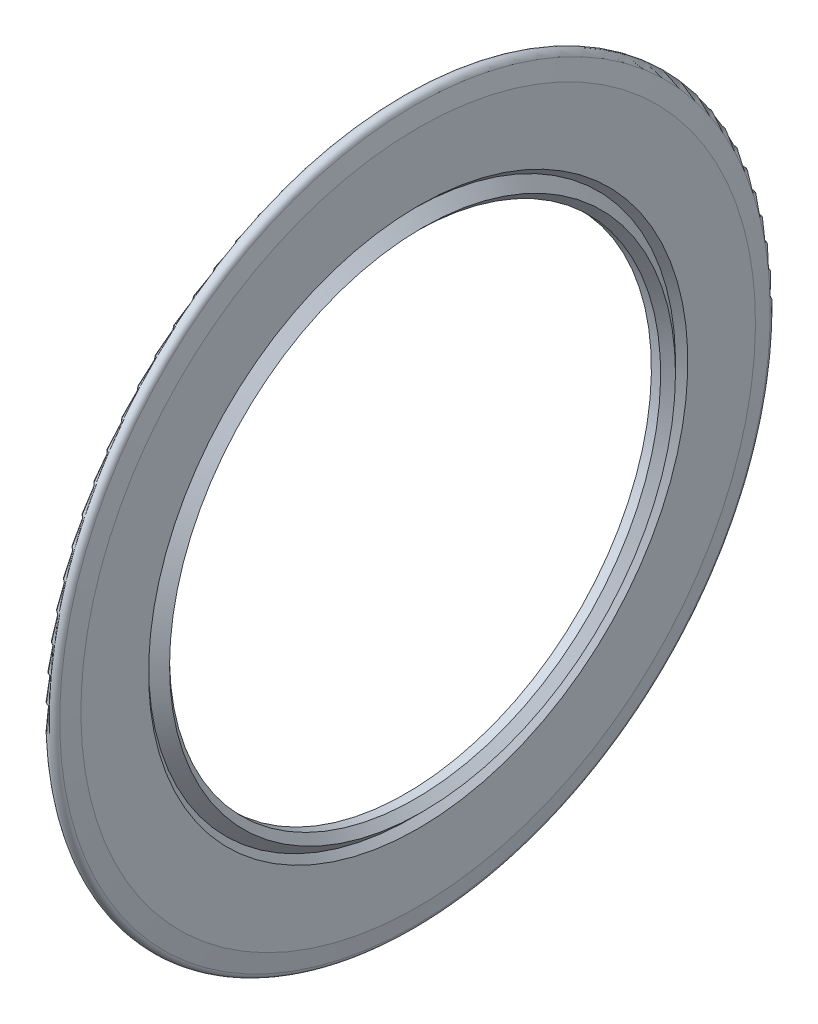
ISO-10303-21;
HEADER;
FILE_DESCRIPTION(('STEP AP214'),'2;1');
FILE_NAME('part.step','',(''),(''),'','','');
FILE_SCHEMA(('AUTOMOTIVE_DESIGN { 1 0 10303 214 1 1 1 1 }'));
ENDSEC;
DATA;
#1=APPLICATION_CONTEXT('core data for automotive mechanical design processes');
#2=APPLICATION_PROTOCOL_DEFINITION('international standard','automotive_design',2000,#1);
#3=PRODUCT_CONTEXT('',#1,'mechanical');
#4=PRODUCT('Part','Part','',(#3));
#5=PRODUCT_RELATED_PRODUCT_CATEGORY('part','',(#4));
#6=PRODUCT_DEFINITION_FORMATION('','',#4);
#7=PRODUCT_DEFINITION_CONTEXT('part definition',#1,'design');
#8=PRODUCT_DEFINITION('design','',#6,#7);
#9=PRODUCT_DEFINITION_SHAPE('','',#8);
#10=(LENGTH_UNIT() NAMED_UNIT(*) SI_UNIT(.MILLI.,.METRE.));
#11=(NAMED_UNIT(*) PLANE_ANGLE_UNIT() SI_UNIT($,.RADIAN.));
#12=(NAMED_UNIT(*) SI_UNIT($,.STERADIAN.) SOLID_ANGLE_UNIT());
#13=UNCERTAINTY_MEASURE_WITH_UNIT(LENGTH_MEASURE(1.E-05),#10,'distance_accuracy_value','');
#14=(GEOMETRIC_REPRESENTATION_CONTEXT(3) GLOBAL_UNCERTAINTY_ASSIGNED_CONTEXT((#13)) GLOBAL_UNIT_ASSIGNED_CONTEXT((#10,
#11,#12)) REPRESENTATION_CONTEXT('',''));
#15=CARTESIAN_POINT('',(0.,0.,0.));
#16=DIRECTION('',(0.,0.,1.));
#17=DIRECTION('',(1.,0.,0.));
#18=AXIS2_PLACEMENT_3D('',#15,#16,#17);
#19=CARTESIAN_POINT('',(0.23,25.73235,0.));
#20=DIRECTION('',(-1.,0.,0.));
#21=DIRECTION('',(0.,-1.,0.));
#22=AXIS2_PLACEMENT_3D('',#19,#20,#21);
#23=PLANE('',#22);
#24=CARTESIAN_POINT('',(0.23,0.,0.));
#25=DIRECTION('',(1.,0.,0.));
#26=DIRECTION('',(0.,1.,0.));
#27=AXIS2_PLACEMENT_3D('',#24,#25,#26);
#28=CIRCLE('',#27,25.08835);
#29=CARTESIAN_POINT('',(0.23,25.08835,0.));
#30=VERTEX_POINT('',#29);
#31=EDGE_CURVE('E11',#30,#30,#28,.T.);
#32=ORIENTED_EDGE('',*,*,#31,.T.);
#33=EDGE_LOOP('',(#32));
#34=FACE_BOUND('',#33,.T.);
#35=CARTESIAN_POINT('',(0.23,0.,0.));
#36=DIRECTION('',(1.,0.,0.));
#37=DIRECTION('',(0.,1.,0.));
#38=AXIS2_PLACEMENT_3D('',#35,#36,#37);
#39=CIRCLE('',#38,26.37635);
#40=CARTESIAN_POINT('',(0.23,26.37635,0.));
#41=VERTEX_POINT('',#40);
#42=EDGE_CURVE('E107',#41,#41,#39,.T.);
#43=ORIENTED_EDGE('',*,*,#42,.F.);
#44=EDGE_LOOP('',(#43));
#45=FACE_BOUND('',#44,.T.);
#46=ADVANCED_FACE('F17',(#34,#45),#23,.T.);
#47=CARTESIAN_POINT('',(0.345,0.,0.));
#48=DIRECTION('',(-1.,0.,0.));
#49=DIRECTION('',(0.,1.,0.));
#50=AXIS2_PLACEMENT_3D('',#47,#48,#49);
#51=CONICAL_SURFACE('',#50,24.97335,0.785398163397448);
#52=CARTESIAN_POINT('',(0.46,0.,0.));
#53=DIRECTION('',(1.,0.,0.));
#54=DIRECTION('',(0.,1.,0.));
#55=AXIS2_PLACEMENT_3D('',#52,#53,#54);
#56=CIRCLE('',#55,24.85835);
#57=CARTESIAN_POINT('',(0.46,24.85835,0.));
#58=VERTEX_POINT('',#57);
#59=EDGE_CURVE('E28',#58,#58,#56,.T.);
#60=ORIENTED_EDGE('',*,*,#59,.T.);
#61=EDGE_LOOP('',(#60));
#62=FACE_BOUND('',#61,.T.);
#63=ORIENTED_EDGE('',*,*,#31,.F.);
#64=EDGE_LOOP('',(#63));
#65=FACE_BOUND('',#64,.T.);
#66=ADVANCED_FACE('F155',(#62,#65),#51,.F.);
#67=CARTESIAN_POINT('',(0.46,22.67335,0.));
#68=DIRECTION('',(-1.,0.,0.));
#69=DIRECTION('',(0.,-1.,0.));
#70=AXIS2_PLACEMENT_3D('',#67,#68,#69);
#71=PLANE('',#70);
#72=CARTESIAN_POINT('',(0.46,0.,0.));
#73=DIRECTION('',(1.,0.,0.));
#74=DIRECTION('',(0.,1.,0.));
#75=AXIS2_PLACEMENT_3D('',#72,#73,#74);
#76=CIRCLE('',#75,20.48835);
#77=CARTESIAN_POINT('',(0.46,20.48835,0.));
#78=VERTEX_POINT('',#77);
#79=EDGE_CURVE('E67',#78,#78,#76,.T.);
#80=ORIENTED_EDGE('',*,*,#79,.T.);
#81=EDGE_LOOP('',(#80));
#82=FACE_BOUND('',#81,.T.);
#83=ORIENTED_EDGE('',*,*,#59,.F.);
#84=EDGE_LOOP('',(#83));
#85=FACE_BOUND('',#84,.T.);
#86=ADVANCED_FACE('F161',(#82,#85),#71,.T.);
#87=CARTESIAN_POINT('',(0.345,0.,0.));
#88=DIRECTION('',(1.,0.,0.));
#89=DIRECTION('',(0.,1.,0.));
#90=AXIS2_PLACEMENT_3D('',#87,#88,#89);
#91=CONICAL_SURFACE('',#90,20.37335,0.785398163397448);
#92=CARTESIAN_POINT('',(0.23,0.,0.));
#93=DIRECTION('',(1.,0.,0.));
#94=DIRECTION('',(0.,1.,0.));
#95=AXIS2_PLACEMENT_3D('',#92,#93,#94);
#96=CIRCLE('',#95,20.25835);
#97=CARTESIAN_POINT('',(0.23,20.25835,0.));
#98=VERTEX_POINT('',#97);
#99=EDGE_CURVE('E74',#98,#98,#96,.T.);
#100=ORIENTED_EDGE('',*,*,#99,.T.);
#101=EDGE_LOOP('',(#100));
#102=FACE_BOUND('',#101,.T.);
#103=ORIENTED_EDGE('',*,*,#79,.F.);
#104=EDGE_LOOP('',(#103));
#105=FACE_BOUND('',#104,.T.);
#106=ADVANCED_FACE('F194',(#102,#105),#91,.T.);
#107=CARTESIAN_POINT('',(0.23,19.93635,0.));
#108=DIRECTION('',(-1.,0.,0.));
#109=DIRECTION('',(0.,-1.,0.));
#110=AXIS2_PLACEMENT_3D('',#107,#108,#109);
#111=PLANE('',#110);
#112=CARTESIAN_POINT('',(0.23,0.,0.));
#113=DIRECTION('',(1.,0.,0.));
#114=DIRECTION('',(0.,1.,0.));
#115=AXIS2_PLACEMENT_3D('',#112,#113,#114);
#116=CIRCLE('',#115,19.61435);
#117=CARTESIAN_POINT('',(0.23,19.61435,0.));
#118=VERTEX_POINT('',#117);
#119=EDGE_CURVE('E78',#118,#118,#116,.T.);
#120=ORIENTED_EDGE('',*,*,#119,.T.);
#121=EDGE_LOOP('',(#120));
#122=FACE_BOUND('',#121,.T.);
#123=ORIENTED_EDGE('',*,*,#99,.F.);
#124=EDGE_LOOP('',(#123));
#125=FACE_BOUND('',#124,.T.);
#126=ADVANCED_FACE('F196',(#122,#125),#111,.T.);
#127=CARTESIAN_POINT('',(0.6206625,0.,0.));
#128=DIRECTION('',(-1.,0.,0.));
#129=DIRECTION('',(0.,1.,0.));
#130=AXIS2_PLACEMENT_3D('',#127,#128,#129);
#131=CONICAL_SURFACE('',#130,19.2236875,0.78539816339745);
#132=CARTESIAN_POINT('',(1.011325,0.,0.));
#133=DIRECTION('',(1.,0.,0.));
#134=DIRECTION('',(0.,1.,0.));
#135=AXIS2_PLACEMENT_3D('',#132,#133,#134);
#136=CIRCLE('',#135,18.833025);
#137=CARTESIAN_POINT('',(1.011325,18.833025,0.));
#138=VERTEX_POINT('',#137);
#139=EDGE_CURVE('E115',#138,#138,#136,.T.);
#140=ORIENTED_EDGE('',*,*,#139,.T.);
#141=EDGE_LOOP('',(#140));
#142=FACE_BOUND('',#141,.T.);
#143=ORIENTED_EDGE('',*,*,#119,.F.);
#144=EDGE_LOOP('',(#143));
#145=FACE_BOUND('',#144,.T.);
#146=ADVANCED_FACE('F151',(#142,#145),#131,.F.);
#147=CARTESIAN_POINT('',(0.7356625,0.,0.));
#148=DIRECTION('',(1.,0.,0.));
#149=DIRECTION('',(0.,1.,0.));
#150=AXIS2_PLACEMENT_3D('',#147,#148,#149);
#151=CONICAL_SURFACE('',#150,18.5573625,0.785398163397447);
#152=CARTESIAN_POINT('',(0.46,0.,0.));
#153=DIRECTION('',(1.,0.,0.));
#154=DIRECTION('',(0.,1.,0.));
#155=AXIS2_PLACEMENT_3D('',#152,#153,#154);
#156=CIRCLE('',#155,18.2817);
#157=CARTESIAN_POINT('',(0.46,18.2817,0.));
#158=VERTEX_POINT('',#157);
#159=EDGE_CURVE('E21',#158,#158,#156,.T.);
#160=ORIENTED_EDGE('',*,*,#159,.T.);
#161=EDGE_LOOP('',(#160));
#162=FACE_BOUND('',#161,.T.);
#163=ORIENTED_EDGE('',*,*,#139,.F.);
#164=EDGE_LOOP('',(#163));
#165=FACE_BOUND('',#164,.T.);
#166=ADVANCED_FACE('F134',(#162,#165),#151,.T.);
#167=CARTESIAN_POINT('',(0.805,0.,0.));
#168=DIRECTION('',(-1.,0.,0.));
#169=DIRECTION('',(0.,1.,0.));
#170=AXIS2_PLACEMENT_3D('',#167,#168,#169);
#171=CYLINDRICAL_SURFACE('',#170,18.2817);
#172=CARTESIAN_POINT('',(1.15,0.,0.));
#173=DIRECTION('',(1.,0.,0.));
#174=DIRECTION('',(0.,1.,0.));
#175=AXIS2_PLACEMENT_3D('',#172,#173,#174);
#176=CIRCLE('',#175,18.2817);
#177=CARTESIAN_POINT('',(1.15,18.2817,0.));
#178=VERTEX_POINT('',#177);
#179=EDGE_CURVE('E125',#178,#178,#176,.T.);
#180=ORIENTED_EDGE('',*,*,#179,.T.);
#181=EDGE_LOOP('',(#180));
#182=FACE_BOUND('',#181,.T.);
#183=ORIENTED_EDGE('',*,*,#159,.F.);
#184=EDGE_LOOP('',(#183));
#185=FACE_BOUND('',#184,.T.);
#186=ADVANCED_FACE('F137',(#182,#185),#171,.F.);
#187=CARTESIAN_POINT('',(1.4256625,0.,0.));
#188=DIRECTION('',(1.,0.,0.));
#189=DIRECTION('',(0.,1.,0.));
#190=AXIS2_PLACEMENT_3D('',#187,#188,#189);
#191=CONICAL_SURFACE('',#190,18.5573625,0.78539816339745);
#192=CARTESIAN_POINT('',(1.701325,0.,0.));
#193=DIRECTION('',(1.,0.,0.));
#194=DIRECTION('',(0.,1.,0.));
#195=AXIS2_PLACEMENT_3D('',#192,#193,#194);
#196=CIRCLE('',#195,18.833025);
#197=CARTESIAN_POINT('',(1.701325,18.833025,0.));
#198=VERTEX_POINT('',#197);
#199=EDGE_CURVE('E104',#198,#198,#196,.T.);
#200=ORIENTED_EDGE('',*,*,#199,.T.);
#201=EDGE_LOOP('',(#200));
#202=FACE_BOUND('',#201,.T.);
#203=ORIENTED_EDGE('',*,*,#179,.F.);
#204=EDGE_LOOP('',(#203));
#205=FACE_BOUND('',#204,.T.);
#206=ADVANCED_FACE('F139',(#202,#205),#191,.F.);
#207=CARTESIAN_POINT('',(1.3106625,0.,0.));
#208=DIRECTION('',(-1.,0.,0.));
#209=DIRECTION('',(0.,1.,0.));
#210=AXIS2_PLACEMENT_3D('',#207,#208,#209);
#211=CONICAL_SURFACE('',#210,19.2236875,0.785398163397448);
#212=CARTESIAN_POINT('',(0.92,0.,0.));
#213=DIRECTION('',(1.,0.,0.));
#214=DIRECTION('',(0.,1.,0.));
#215=AXIS2_PLACEMENT_3D('',#212,#213,#214);
#216=CIRCLE('',#215,19.61435);
#217=CARTESIAN_POINT('',(0.92,19.61435,0.));
#218=VERTEX_POINT('',#217);
#219=EDGE_CURVE('E98',#218,#218,#216,.T.);
#220=ORIENTED_EDGE('',*,*,#219,.T.);
#221=EDGE_LOOP('',(#220));
#222=FACE_BOUND('',#221,.T.);
#223=ORIENTED_EDGE('',*,*,#199,.F.);
#224=EDGE_LOOP('',(#223));
#225=FACE_BOUND('',#224,.T.);
#226=ADVANCED_FACE('F19',(#222,#225),#211,.T.);
#227=CARTESIAN_POINT('',(1.15,0.,0.));
#228=DIRECTION('',(1.,0.,0.));
#229=DIRECTION('',(0.,1.,0.));
#230=AXIS2_PLACEMENT_3D('',#227,#228,#229);
#231=CONICAL_SURFACE('',#230,19.84435,0.785398163397452);
#232=CARTESIAN_POINT('',(1.38,0.,0.));
#233=DIRECTION('',(1.,0.,0.));
#234=DIRECTION('',(0.,1.,0.));
#235=AXIS2_PLACEMENT_3D('',#232,#233,#234);
#236=CIRCLE('',#235,20.07435);
#237=CARTESIAN_POINT('',(1.38,20.07435,0.));
#238=VERTEX_POINT('',#237);
#239=EDGE_CURVE('E93',#238,#238,#236,.T.);
#240=ORIENTED_EDGE('',*,*,#239,.T.);
#241=EDGE_LOOP('',(#240));
#242=FACE_BOUND('',#241,.T.);
#243=ORIENTED_EDGE('',*,*,#219,.F.);
#244=EDGE_LOOP('',(#243));
#245=FACE_BOUND('',#244,.T.);
#246=ADVANCED_FACE('F94',(#242,#245),#231,.F.);
#247=CARTESIAN_POINT('',(1.38,22.593274983355,0.));
#248=DIRECTION('',(1.,0.,0.));
#249=DIRECTION('',(0.,1.,0.));
#250=AXIS2_PLACEMENT_3D('',#247,#248,#249);
#251=PLANE('',#250);
#252=CARTESIAN_POINT('',(1.38,0.,0.));
#253=DIRECTION('',(1.,0.,0.));
#254=DIRECTION('',(0.,1.,0.));
#255=AXIS2_PLACEMENT_3D('',#252,#253,#254);
#256=CIRCLE('',#255,25.1121999667098);
#257=CARTESIAN_POINT('',(1.38,25.1121999667098,0.));
#258=VERTEX_POINT('',#257);
#259=EDGE_CURVE('E99',#258,#258,#256,.T.);
#260=ORIENTED_EDGE('',*,*,#259,.T.);
#261=EDGE_LOOP('',(#260));
#262=FACE_BOUND('',#261,.T.);
#263=ORIENTED_EDGE('',*,*,#239,.F.);
#264=EDGE_LOOP('',(#263));
#265=FACE_BOUND('',#264,.T.);
#266=ADVANCED_FACE('F166',(#262,#265),#251,.T.);
#267=CARTESIAN_POINT('',(1.26150578319281,0.,0.));
#268=DIRECTION('',(-1.,0.,0.));
#269=DIRECTION('',(0.,1.,0.));
#270=AXIS2_PLACEMENT_3D('',#267,#268,#269);
#271=CONICAL_SURFACE('',#270,25.7842140642183,1.39626340159546);
#272=CARTESIAN_POINT('',(1.14301156638562,0.,0.));
#273=DIRECTION('',(1.,0.,0.));
#274=DIRECTION('',(0.,1.,0.));
#275=AXIS2_PLACEMENT_3D('',#272,#273,#274);
#276=CIRCLE('',#275,26.4562281617268);
#277=CARTESIAN_POINT('',(1.14301156638562,26.4562281617268,0.));
#278=VERTEX_POINT('',#277);
#279=EDGE_CURVE('E112',#278,#278,#276,.T.);
#280=ORIENTED_EDGE('',*,*,#279,.T.);
#281=EDGE_LOOP('',(#280));
#282=FACE_BOUND('',#281,.T.);
#283=ORIENTED_EDGE('',*,*,#259,.F.);
#284=EDGE_LOOP('',(#283));
#285=FACE_BOUND('',#284,.T.);
#286=ADVANCED_FACE('F167',(#282,#285),#271,.T.);
#287=CARTESIAN_POINT('',(0.69,0.,0.));
#288=DIRECTION('',(1.,0.,0.));
#289=DIRECTION('',(0.,0.,-1.));
#290=AXIS2_PLACEMENT_3D('',#287,#288,#289);
#291=TOROIDAL_SURFACE('',#290,26.37635,0.46);
#292=ORIENTED_EDGE('',*,*,#42,.T.);
#293=EDGE_LOOP('',(#292));
#294=FACE_BOUND('',#293,.T.);
#295=ORIENTED_EDGE('',*,*,#279,.F.);
#296=EDGE_LOOP('',(#295));
#297=FACE_BOUND('',#296,.T.);
#298=ADVANCED_FACE('F168',(#294,#297),#291,.T.);
#299=CLOSED_SHELL('',(#46,#66,#86,#106,#126,#146,#166,#186,#206,#226,#246,#266,#286,#298));
#300=MANIFOLD_SOLID_BREP('B1',#299);
#301=ADVANCED_BREP_SHAPE_REPRESENTATION('',(#18,#300),#14);
#302=SHAPE_DEFINITION_REPRESENTATION(#9,#301);
ENDSEC;
END-ISO-10303-21;
